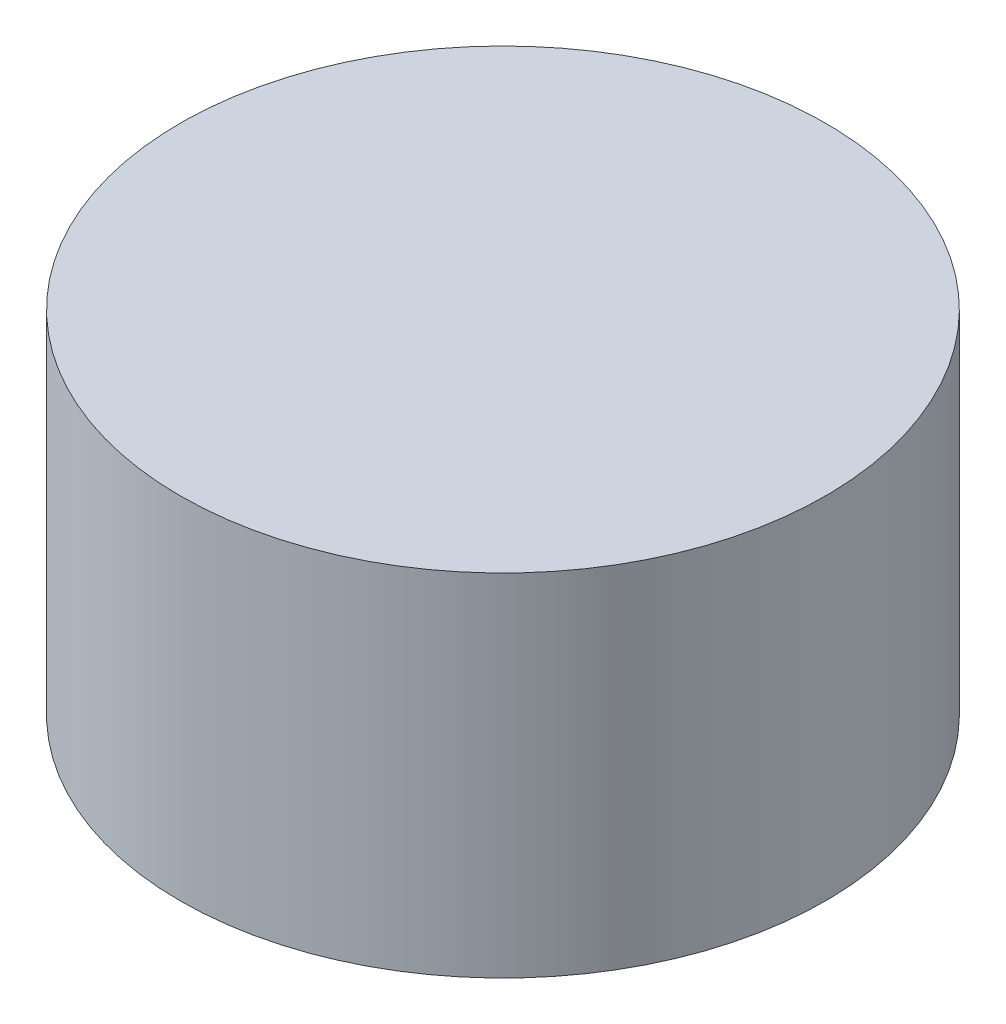
ISO-10303-21;
HEADER;
FILE_DESCRIPTION(('STEP AP214'),'2;1');
FILE_NAME('part.step','',(''),(''),'','','');
FILE_SCHEMA(('AUTOMOTIVE_DESIGN { 1 0 10303 214 1 1 1 1 }'));
ENDSEC;
DATA;
#1=APPLICATION_CONTEXT('core data for automotive mechanical design processes');
#2=APPLICATION_PROTOCOL_DEFINITION('international standard','automotive_design',2000,#1);
#3=PRODUCT_CONTEXT('',#1,'mechanical');
#4=PRODUCT('Part','Part','',(#3));
#5=PRODUCT_RELATED_PRODUCT_CATEGORY('part','',(#4));
#6=PRODUCT_DEFINITION_FORMATION('','',#4);
#7=PRODUCT_DEFINITION_CONTEXT('part definition',#1,'design');
#8=PRODUCT_DEFINITION('design','',#6,#7);
#9=PRODUCT_DEFINITION_SHAPE('','',#8);
#10=(LENGTH_UNIT() NAMED_UNIT(*) SI_UNIT(.MILLI.,.METRE.));
#11=(NAMED_UNIT(*) PLANE_ANGLE_UNIT() SI_UNIT($,.RADIAN.));
#12=(NAMED_UNIT(*) SI_UNIT($,.STERADIAN.) SOLID_ANGLE_UNIT());
#13=UNCERTAINTY_MEASURE_WITH_UNIT(LENGTH_MEASURE(1.E-05),#10,'distance_accuracy_value','');
#14=(GEOMETRIC_REPRESENTATION_CONTEXT(3) GLOBAL_UNCERTAINTY_ASSIGNED_CONTEXT((#13)) GLOBAL_UNIT_ASSIGNED_CONTEXT((#10,
#11,#12)) REPRESENTATION_CONTEXT('',''));
#15=CARTESIAN_POINT('',(0.,0.,0.));
#16=DIRECTION('',(0.,0.,1.));
#17=DIRECTION('',(1.,0.,0.));
#18=AXIS2_PLACEMENT_3D('',#15,#16,#17);
#19=CARTESIAN_POINT('',(260.,89.5,1687.5));
#20=DIRECTION('',(0.,1.,0.));
#21=DIRECTION('',(0.,0.,1.));
#22=AXIS2_PLACEMENT_3D('',#19,#20,#21);
#23=PLANE('',#22);
#24=CARTESIAN_POINT('',(260.,89.5,1687.5));
#25=DIRECTION('',(0.,1.,0.));
#26=DIRECTION('',(0.,0.,1.));
#27=AXIS2_PLACEMENT_3D('',#24,#25,#26);
#28=CIRCLE('',#27,47.8440461621477);
#29=CARTESIAN_POINT('',(260.,89.5,1735.34404616215));
#30=VERTEX_POINT('',#29);
#31=EDGE_CURVE('E18',#30,#30,#28,.F.);
#32=ORIENTED_EDGE('',*,*,#31,.F.);
#33=EDGE_LOOP('',(#32));
#34=FACE_BOUND('',#33,.T.);
#35=ADVANCED_FACE('F15',(#34),#23,.T.);
#36=CARTESIAN_POINT('',(468.387738223436,37.5,1778.));
#37=DIRECTION('',(0.,-1.,0.));
#38=DIRECTION('',(0.,0.,-1.));
#39=AXIS2_PLACEMENT_3D('',#36,#37,#38);
#40=PLANE('',#39);
#41=CARTESIAN_POINT('',(260.,37.5,1687.5));
#42=DIRECTION('',(0.,1.,0.));
#43=DIRECTION('',(0.,0.,1.));
#44=AXIS2_PLACEMENT_3D('',#41,#42,#43);
#45=CIRCLE('',#44,47.8440461621477);
#46=CARTESIAN_POINT('',(260.,37.5,1735.34404616215));
#47=VERTEX_POINT('',#46);
#48=EDGE_CURVE('E10',#47,#47,#45,.T.);
#49=ORIENTED_EDGE('',*,*,#48,.F.);
#50=EDGE_LOOP('',(#49));
#51=FACE_BOUND('',#50,.T.);
#52=ADVANCED_FACE('F30',(#51),#40,.T.);
#53=CARTESIAN_POINT('',(260.,-97.8233979226274,1687.5));
#54=DIRECTION('',(0.,1.,0.));
#55=DIRECTION('',(0.,0.,1.));
#56=AXIS2_PLACEMENT_3D('',#53,#54,#55);
#57=CYLINDRICAL_SURFACE('',#56,47.8440461621477);
#58=ORIENTED_EDGE('',*,*,#48,.T.);
#59=EDGE_LOOP('',(#58));
#60=FACE_BOUND('',#59,.T.);
#61=ORIENTED_EDGE('',*,*,#31,.T.);
#62=EDGE_LOOP('',(#61));
#63=FACE_BOUND('',#62,.T.);
#64=ADVANCED_FACE('F27',(#60,#63),#57,.T.);
#65=CLOSED_SHELL('',(#35,#52,#64));
#66=MANIFOLD_SOLID_BREP('B1',#65);
#67=ADVANCED_BREP_SHAPE_REPRESENTATION('',(#18,#66),#14);
#68=SHAPE_DEFINITION_REPRESENTATION(#9,#67);
ENDSEC;
END-ISO-10303-21;
